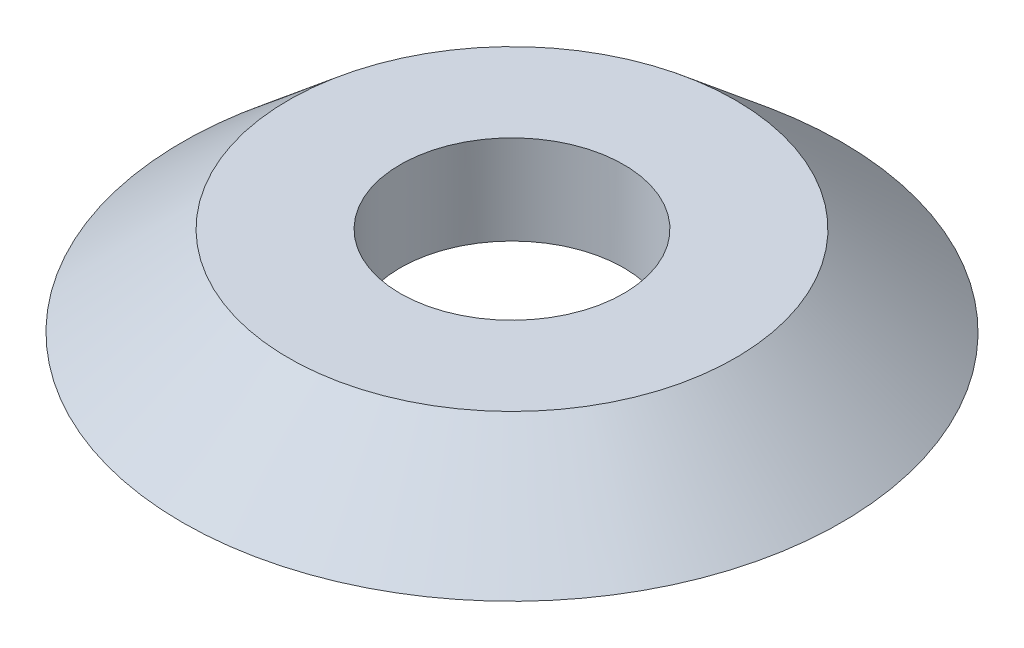
ISO-10303-21;
HEADER;
FILE_DESCRIPTION(('STEP AP214'),'2;1');
FILE_NAME('part.step','',(''),(''),'','','');
FILE_SCHEMA(('AUTOMOTIVE_DESIGN { 1 0 10303 214 1 1 1 1 }'));
ENDSEC;
DATA;
#1=APPLICATION_CONTEXT('core data for automotive mechanical design processes');
#2=APPLICATION_PROTOCOL_DEFINITION('international standard','automotive_design',2000,#1);
#3=PRODUCT_CONTEXT('',#1,'mechanical');
#4=PRODUCT('Part','Part','',(#3));
#5=PRODUCT_RELATED_PRODUCT_CATEGORY('part','',(#4));
#6=PRODUCT_DEFINITION_FORMATION('','',#4);
#7=PRODUCT_DEFINITION_CONTEXT('part definition',#1,'design');
#8=PRODUCT_DEFINITION('design','',#6,#7);
#9=PRODUCT_DEFINITION_SHAPE('','',#8);
#10=(LENGTH_UNIT() NAMED_UNIT(*) SI_UNIT(.MILLI.,.METRE.));
#11=(NAMED_UNIT(*) PLANE_ANGLE_UNIT() SI_UNIT($,.RADIAN.));
#12=(NAMED_UNIT(*) SI_UNIT($,.STERADIAN.) SOLID_ANGLE_UNIT());
#13=UNCERTAINTY_MEASURE_WITH_UNIT(LENGTH_MEASURE(1.E-05),#10,'distance_accuracy_value','');
#14=(GEOMETRIC_REPRESENTATION_CONTEXT(3) GLOBAL_UNCERTAINTY_ASSIGNED_CONTEXT((#13)) GLOBAL_UNIT_ASSIGNED_CONTEXT((#10,
#11,#12)) REPRESENTATION_CONTEXT('',''));
#15=CARTESIAN_POINT('',(0.,0.,0.));
#16=DIRECTION('',(0.,0.,1.));
#17=DIRECTION('',(1.,0.,0.));
#18=AXIS2_PLACEMENT_3D('',#15,#16,#17);
#19=CARTESIAN_POINT('',(0.,2.,0.));
#20=DIRECTION('',(0.,-1.,0.));
#21=DIRECTION('',(0.,0.,-1.));
#22=AXIS2_PLACEMENT_3D('',#19,#20,#21);
#23=PLANE('',#22);
#24=CARTESIAN_POINT('',(0.,2.,0.));
#25=DIRECTION('',(0.,1.,0.));
#26=DIRECTION('',(0.,0.,1.));
#27=AXIS2_PLACEMENT_3D('',#24,#25,#26);
#28=CIRCLE('',#27,2.5);
#29=CARTESIAN_POINT('',(0.,2.,2.5));
#30=VERTEX_POINT('',#29);
#31=EDGE_CURVE('E51',#30,#30,#28,.T.);
#32=ORIENTED_EDGE('',*,*,#31,.F.);
#33=EDGE_LOOP('',(#32));
#34=FACE_BOUND('',#33,.T.);
#35=CARTESIAN_POINT('',(0.,2.,0.));
#36=DIRECTION('',(0.,-1.,0.));
#37=DIRECTION('',(0.,0.,-1.));
#38=AXIS2_PLACEMENT_3D('',#35,#36,#37);
#39=CIRCLE('',#38,5.);
#40=CARTESIAN_POINT('',(0.,2.,-5.));
#41=VERTEX_POINT('',#40);
#42=EDGE_CURVE('E44',#41,#41,#39,.T.);
#43=ORIENTED_EDGE('',*,*,#42,.F.);
#44=EDGE_LOOP('',(#43));
#45=FACE_BOUND('',#44,.T.);
#46=ADVANCED_FACE('F36',(#34,#45),#23,.F.);
#47=CARTESIAN_POINT('',(0.,0.,0.));
#48=DIRECTION('',(0.,-1.,0.));
#49=DIRECTION('',(0.,0.,-1.));
#50=AXIS2_PLACEMENT_3D('',#47,#48,#49);
#51=PLANE('',#50);
#52=CARTESIAN_POINT('',(0.,0.,0.));
#53=DIRECTION('',(0.,-1.,0.));
#54=DIRECTION('',(0.,0.,-1.));
#55=AXIS2_PLACEMENT_3D('',#52,#53,#54);
#56=CIRCLE('',#55,2.5);
#57=CARTESIAN_POINT('',(0.,0.,-2.5));
#58=VERTEX_POINT('',#57);
#59=EDGE_CURVE('E39',#58,#58,#56,.T.);
#60=ORIENTED_EDGE('',*,*,#59,.F.);
#61=EDGE_LOOP('',(#60));
#62=FACE_BOUND('',#61,.T.);
#63=CARTESIAN_POINT('',(0.,0.,0.));
#64=DIRECTION('',(0.,-1.,0.));
#65=DIRECTION('',(0.,0.,-1.));
#66=AXIS2_PLACEMENT_3D('',#63,#64,#65);
#67=CIRCLE('',#66,7.375);
#68=CARTESIAN_POINT('',(0.,0.,-7.375));
#69=VERTEX_POINT('',#68);
#70=EDGE_CURVE('E10',#69,#69,#67,.T.);
#71=ORIENTED_EDGE('',*,*,#70,.T.);
#72=EDGE_LOOP('',(#71));
#73=FACE_BOUND('',#72,.T.);
#74=ADVANCED_FACE('F62',(#62,#73),#51,.T.);
#75=CARTESIAN_POINT('',(0.,2.,0.));
#76=DIRECTION('',(0.,-1.,0.));
#77=DIRECTION('',(0.,0.,-1.));
#78=AXIS2_PLACEMENT_3D('',#75,#76,#77);
#79=CONICAL_SURFACE('',#78,5.,0.870903457075653);
#80=ORIENTED_EDGE('',*,*,#70,.F.);
#81=EDGE_LOOP('',(#80));
#82=FACE_BOUND('',#81,.T.);
#83=ORIENTED_EDGE('',*,*,#42,.T.);
#84=EDGE_LOOP('',(#83));
#85=FACE_BOUND('',#84,.T.);
#86=ADVANCED_FACE('F64',(#82,#85),#79,.T.);
#87=CARTESIAN_POINT('',(0.,-8.,0.));
#88=DIRECTION('',(0.,1.,0.));
#89=DIRECTION('',(0.,0.,1.));
#90=AXIS2_PLACEMENT_3D('',#87,#88,#89);
#91=CYLINDRICAL_SURFACE('',#90,2.5);
#92=ORIENTED_EDGE('',*,*,#59,.T.);
#93=EDGE_LOOP('',(#92));
#94=FACE_BOUND('',#93,.T.);
#95=ORIENTED_EDGE('',*,*,#31,.T.);
#96=EDGE_LOOP('',(#95));
#97=FACE_BOUND('',#96,.T.);
#98=ADVANCED_FACE('F60',(#94,#97),#91,.F.);
#99=CLOSED_SHELL('',(#46,#74,#86,#98));
#100=MANIFOLD_SOLID_BREP('B2',#99);
#101=ADVANCED_BREP_SHAPE_REPRESENTATION('',(#18,#100),#14);
#102=SHAPE_DEFINITION_REPRESENTATION(#9,#101);
ENDSEC;
END-ISO-10303-21;
